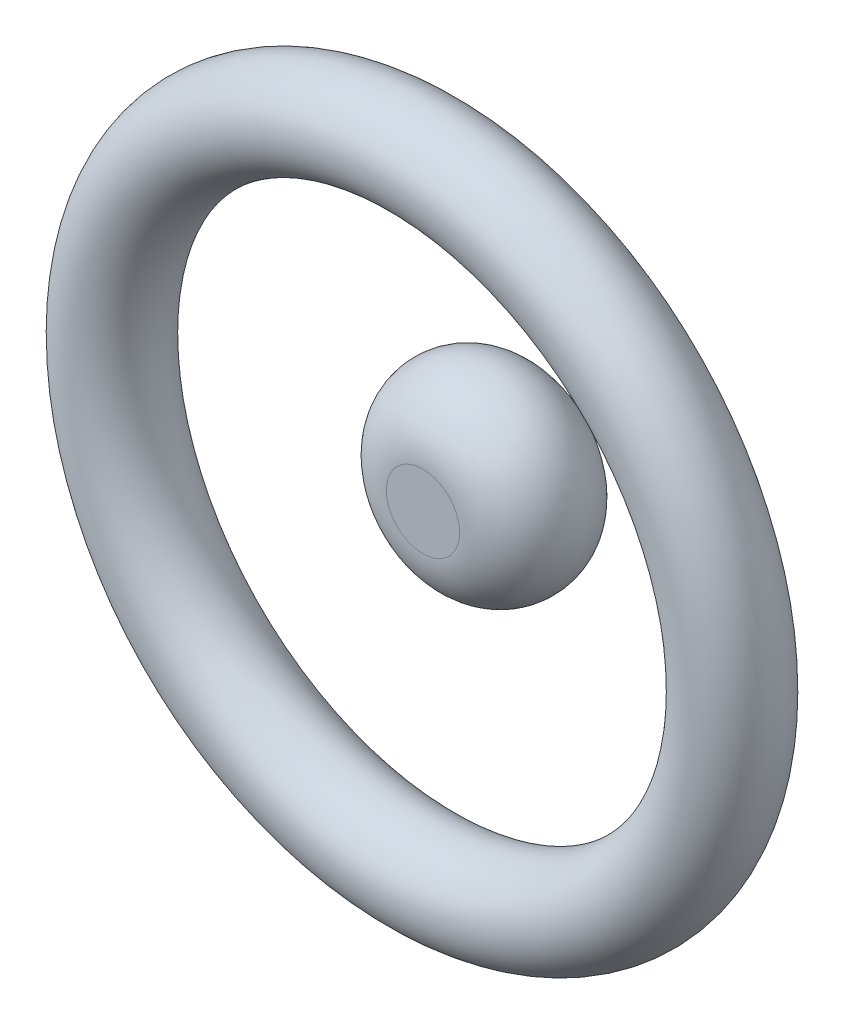
ISO-10303-21;
HEADER;
FILE_DESCRIPTION(('STEP AP214'),'2;1');
FILE_NAME('part.step','',(''),(''),'','','');
FILE_SCHEMA(('AUTOMOTIVE_DESIGN { 1 0 10303 214 1 1 1 1 }'));
ENDSEC;
DATA;
#1=APPLICATION_CONTEXT('core data for automotive mechanical design processes');
#2=APPLICATION_PROTOCOL_DEFINITION('international standard','automotive_design',2000,#1);
#3=PRODUCT_CONTEXT('',#1,'mechanical');
#4=PRODUCT('Part','Part','',(#3));
#5=PRODUCT_RELATED_PRODUCT_CATEGORY('part','',(#4));
#6=PRODUCT_DEFINITION_FORMATION('','',#4);
#7=PRODUCT_DEFINITION_CONTEXT('part definition',#1,'design');
#8=PRODUCT_DEFINITION('design','',#6,#7);
#9=PRODUCT_DEFINITION_SHAPE('','',#8);
#10=(LENGTH_UNIT() NAMED_UNIT(*) SI_UNIT(.MILLI.,.METRE.));
#11=(NAMED_UNIT(*) PLANE_ANGLE_UNIT() SI_UNIT($,.RADIAN.));
#12=(NAMED_UNIT(*) SI_UNIT($,.STERADIAN.) SOLID_ANGLE_UNIT());
#13=UNCERTAINTY_MEASURE_WITH_UNIT(LENGTH_MEASURE(1.E-05),#10,'distance_accuracy_value','');
#14=(GEOMETRIC_REPRESENTATION_CONTEXT(3) GLOBAL_UNCERTAINTY_ASSIGNED_CONTEXT((#13)) GLOBAL_UNIT_ASSIGNED_CONTEXT((#10,
#11,#12)) REPRESENTATION_CONTEXT('',''));
#15=CARTESIAN_POINT('',(0.,0.,0.));
#16=DIRECTION('',(0.,0.,1.));
#17=DIRECTION('',(1.,0.,0.));
#18=AXIS2_PLACEMENT_3D('',#15,#16,#17);
#19=CARTESIAN_POINT('',(0.,0.,25.4));
#20=DIRECTION('',(0.,0.,1.));
#21=DIRECTION('',(1.,0.,0.));
#22=AXIS2_PLACEMENT_3D('',#19,#20,#21);
#23=TOROIDAL_SURFACE('',#22,127.,19.05);
#24=CARTESIAN_POINT('',(146.05,0.,25.4));
#25=VERTEX_POINT('',#24);
#26=VERTEX_LOOP('',#25);
#27=FACE_BOUND('',#26,.T.);
#28=ADVANCED_FACE('F45',(#27),#23,.T.);
#29=CLOSED_SHELL('',(#28));
#30=MANIFOLD_SOLID_BREP('B2',#29);
#31=CARTESIAN_POINT('',(0.,0.,25.));
#32=DIRECTION('',(0.,0.,-1.));
#33=DIRECTION('',(-1.,0.,0.));
#34=AXIS2_PLACEMENT_3D('',#31,#32,#33);
#35=PLANE('',#34);
#36=CARTESIAN_POINT('',(0.,0.,25.));
#37=DIRECTION('',(0.,0.,1.));
#38=DIRECTION('',(1.,0.,0.));
#39=AXIS2_PLACEMENT_3D('',#36,#37,#38);
#40=CIRCLE('',#39,15.);
#41=CARTESIAN_POINT('',(15.,0.,25.));
#42=VERTEX_POINT('',#41);
#43=EDGE_CURVE('E44',#42,#42,#40,.T.);
#44=ORIENTED_EDGE('',*,*,#43,.T.);
#45=EDGE_LOOP('',(#44));
#46=FACE_BOUND('',#45,.T.);
#47=ADVANCED_FACE('F58',(#46),#35,.F.);
#48=CARTESIAN_POINT('',(0.,0.,0.));
#49=DIRECTION('',(0.,0.,1.));
#50=DIRECTION('',(1.,0.,0.));
#51=AXIS2_PLACEMENT_3D('',#48,#49,#50);
#52=DEGENERATE_TOROIDAL_SURFACE('',#51,15.,25.,.T.);
#53=ORIENTED_EDGE('',*,*,#43,.F.);
#54=EDGE_LOOP('',(#53));
#55=FACE_BOUND('',#54,.T.);
#56=CARTESIAN_POINT('',(0.,0.,-25.));
#57=DIRECTION('',(0.,0.,1.));
#58=DIRECTION('',(1.,0.,0.));
#59=AXIS2_PLACEMENT_3D('',#56,#57,#58);
#60=CIRCLE('',#59,15.);
#61=CARTESIAN_POINT('',(15.,0.,-25.));
#62=VERTEX_POINT('',#61);
#63=EDGE_CURVE('E64',#62,#62,#60,.T.);
#64=ORIENTED_EDGE('',*,*,#63,.T.);
#65=EDGE_LOOP('',(#64));
#66=FACE_BOUND('',#65,.T.);
#67=ADVANCED_FACE('F70',(#55,#66),#52,.T.);
#68=CARTESIAN_POINT('',(0.,15.,-25.));
#69=DIRECTION('',(0.,0.,1.));
#70=DIRECTION('',(1.,0.,0.));
#71=AXIS2_PLACEMENT_3D('',#68,#69,#70);
#72=PLANE('',#71);
#73=ORIENTED_EDGE('',*,*,#63,.F.);
#74=EDGE_LOOP('',(#73));
#75=FACE_BOUND('',#74,.T.);
#76=ADVANCED_FACE('F72',(#75),#72,.F.);
#77=CLOSED_SHELL('',(#47,#67,#76));
#78=MANIFOLD_SOLID_BREP('B6',#77);
#79=ADVANCED_BREP_SHAPE_REPRESENTATION('',(#18,#30,#78),#14);
#80=SHAPE_DEFINITION_REPRESENTATION(#9,#79);
ENDSEC;
END-ISO-10303-21;
